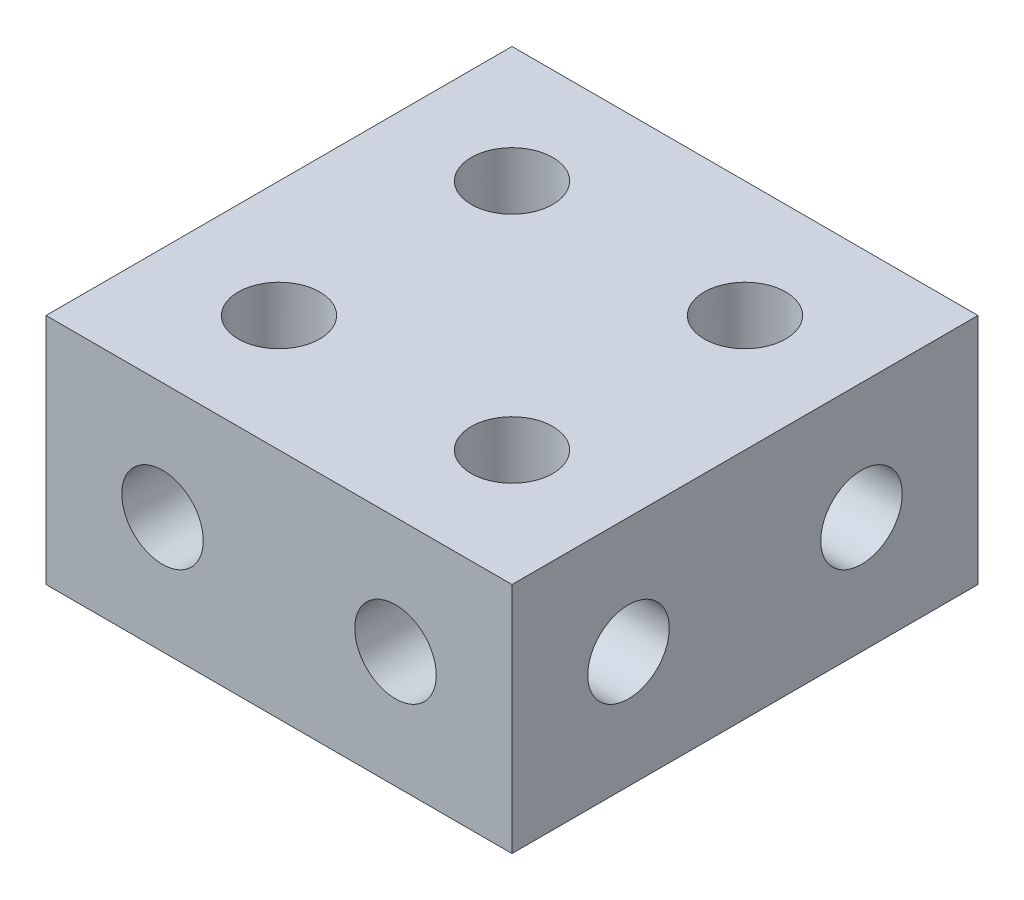
ISO-10303-21;
HEADER;
FILE_DESCRIPTION(('STEP AP214'),'2;1');
FILE_NAME('part.step','',(''),(''),'','','');
FILE_SCHEMA(('AUTOMOTIVE_DESIGN { 1 0 10303 214 1 1 1 1 }'));
ENDSEC;
DATA;
#1=APPLICATION_CONTEXT('core data for automotive mechanical design processes');
#2=APPLICATION_PROTOCOL_DEFINITION('international standard','automotive_design',2000,#1);
#3=PRODUCT_CONTEXT('',#1,'mechanical');
#4=PRODUCT('Part','Part','',(#3));
#5=PRODUCT_RELATED_PRODUCT_CATEGORY('part','',(#4));
#6=PRODUCT_DEFINITION_FORMATION('','',#4);
#7=PRODUCT_DEFINITION_CONTEXT('part definition',#1,'design');
#8=PRODUCT_DEFINITION('design','',#6,#7);
#9=PRODUCT_DEFINITION_SHAPE('','',#8);
#10=(LENGTH_UNIT() NAMED_UNIT(*) SI_UNIT(.MILLI.,.METRE.));
#11=(NAMED_UNIT(*) PLANE_ANGLE_UNIT() SI_UNIT($,.RADIAN.));
#12=(NAMED_UNIT(*) SI_UNIT($,.STERADIAN.) SOLID_ANGLE_UNIT());
#13=UNCERTAINTY_MEASURE_WITH_UNIT(LENGTH_MEASURE(1.E-05),#10,'distance_accuracy_value','');
#14=(GEOMETRIC_REPRESENTATION_CONTEXT(3) GLOBAL_UNCERTAINTY_ASSIGNED_CONTEXT((#13)) GLOBAL_UNIT_ASSIGNED_CONTEXT((#10,
#11,#12)) REPRESENTATION_CONTEXT('',''));
#15=CARTESIAN_POINT('',(0.,0.,0.));
#16=DIRECTION('',(0.,0.,1.));
#17=DIRECTION('',(1.,0.,0.));
#18=AXIS2_PLACEMENT_3D('',#15,#16,#17);
#19=CARTESIAN_POINT('',(15.0000000000001,0.,-5.));
#20=DIRECTION('',(0.,1.,0.));
#21=DIRECTION('',(0.,0.,1.));
#22=AXIS2_PLACEMENT_3D('',#19,#20,#21);
#23=CYLINDRICAL_SURFACE('',#22,1.75);
#24=CARTESIAN_POINT('',(15.0000000000001,10.,-5.));
#25=DIRECTION('',(0.,1.,0.));
#26=DIRECTION('',(0.,0.,1.));
#27=AXIS2_PLACEMENT_3D('',#24,#25,#26);
#28=CIRCLE('',#27,1.75);
#29=CARTESIAN_POINT('',(15.0000000000001,10.,-3.25));
#30=VERTEX_POINT('',#29);
#31=EDGE_CURVE('E254',#30,#30,#28,.T.);
#32=ORIENTED_EDGE('',*,*,#31,.T.);
#33=EDGE_LOOP('',(#32));
#34=FACE_BOUND('',#33,.T.);
#35=CARTESIAN_POINT('',(15.0000000000001,5.,-5.));
#36=DIRECTION('',(0.,0.707106781186547,-0.707106781186547));
#37=DIRECTION('',(0.,0.707106781186547,0.707106781186547));
#38=AXIS2_PLACEMENT_3D('',#35,#36,#37);
#39=ELLIPSE('',#38,2.47487373415291,1.75);
#40=CARTESIAN_POINT('',(16.2374368670765,6.23743686707647,-3.76256313292353));
#41=VERTEX_POINT('',#40);
#42=CARTESIAN_POINT('',(13.7625631329236,6.23743686707644,-3.76256313292355));
#43=VERTEX_POINT('',#42);
#44=EDGE_CURVE('E208',#41,#43,#39,.F.);
#45=ORIENTED_EDGE('',*,*,#44,.T.);
#46=CARTESIAN_POINT('',(15.0000000000001,5.,-5.));
#47=DIRECTION('',(0.707106781186547,0.707106781186547,0.));
#48=DIRECTION('',(-0.707106781186547,0.707106781186547,0.));
#49=AXIS2_PLACEMENT_3D('',#46,#47,#48);
#50=ELLIPSE('',#49,2.47487373415292,1.75);
#51=CARTESIAN_POINT('',(13.7625631329236,6.23743686707647,-6.23743686707647));
#52=VERTEX_POINT('',#51);
#53=EDGE_CURVE('E217',#43,#52,#50,.F.);
#54=ORIENTED_EDGE('',*,*,#53,.T.);
#55=CARTESIAN_POINT('',(15.0000000000001,5.,-5.));
#56=DIRECTION('',(0.,0.707106781186547,0.707106781186547));
#57=DIRECTION('',(0.,0.707106781186547,-0.707106781186547));
#58=AXIS2_PLACEMENT_3D('',#55,#56,#57);
#59=ELLIPSE('',#58,2.47487373415291,1.75);
#60=CARTESIAN_POINT('',(16.2374368670765,6.23743686707645,-6.23743686707644));
#61=VERTEX_POINT('',#60);
#62=EDGE_CURVE('E231',#52,#61,#59,.F.);
#63=ORIENTED_EDGE('',*,*,#62,.T.);
#64=CARTESIAN_POINT('',(15.0000000000001,5.,-5.));
#65=DIRECTION('',(-0.707106781186547,0.707106781186547,0.));
#66=DIRECTION('',(0.707106781186547,0.707106781186547,0.));
#67=AXIS2_PLACEMENT_3D('',#64,#65,#66);
#68=ELLIPSE('',#67,2.47487373415292,1.75);
#69=EDGE_CURVE('E219',#61,#41,#68,.F.);
#70=ORIENTED_EDGE('',*,*,#69,.T.);
#71=EDGE_LOOP('',(#45,#54,#63,#70));
#72=FACE_BOUND('',#71,.T.);
#73=ADVANCED_FACE('F33',(#34,#72),#23,.F.);
#74=CARTESIAN_POINT('',(15.,0.,-15.));
#75=DIRECTION('',(0.,1.,0.));
#76=DIRECTION('',(0.,0.,1.));
#77=AXIS2_PLACEMENT_3D('',#74,#75,#76);
#78=CYLINDRICAL_SURFACE('',#77,1.75);
#79=CARTESIAN_POINT('',(15.,10.,-15.));
#80=DIRECTION('',(0.,1.,0.));
#81=DIRECTION('',(0.,0.,1.));
#82=AXIS2_PLACEMENT_3D('',#79,#80,#81);
#83=CIRCLE('',#82,1.75);
#84=CARTESIAN_POINT('',(15.,10.,-13.25));
#85=VERTEX_POINT('',#84);
#86=EDGE_CURVE('E259',#85,#85,#83,.T.);
#87=ORIENTED_EDGE('',*,*,#86,.T.);
#88=EDGE_LOOP('',(#87));
#89=FACE_BOUND('',#88,.T.);
#90=CARTESIAN_POINT('',(15.,5.,-15.));
#91=DIRECTION('',(0.,0.707106781186547,-0.707106781186547));
#92=DIRECTION('',(0.,0.707106781186547,0.707106781186547));
#93=AXIS2_PLACEMENT_3D('',#90,#91,#92);
#94=ELLIPSE('',#93,2.47487373415292,1.75);
#95=CARTESIAN_POINT('',(16.2374368670765,6.23743686707646,-13.7625631329235));
#96=VERTEX_POINT('',#95);
#97=CARTESIAN_POINT('',(13.7625631329235,6.23743686707646,-13.7625631329235));
#98=VERTEX_POINT('',#97);
#99=EDGE_CURVE('E187',#96,#98,#94,.F.);
#100=ORIENTED_EDGE('',*,*,#99,.T.);
#101=CARTESIAN_POINT('',(15.,5.,-15.));
#102=DIRECTION('',(0.707106781186547,0.707106781186547,0.));
#103=DIRECTION('',(-0.707106781186547,0.707106781186547,0.));
#104=AXIS2_PLACEMENT_3D('',#101,#102,#103);
#105=ELLIPSE('',#104,2.47487373415292,1.75);
#106=CARTESIAN_POINT('',(13.7625631329235,6.23743686707646,-16.2374368670765));
#107=VERTEX_POINT('',#106);
#108=EDGE_CURVE('E171',#98,#107,#105,.F.);
#109=ORIENTED_EDGE('',*,*,#108,.T.);
#110=CARTESIAN_POINT('',(15.,5.,-15.));
#111=DIRECTION('',(0.,0.707106781186547,0.707106781186547));
#112=DIRECTION('',(0.,0.707106781186547,-0.707106781186547));
#113=AXIS2_PLACEMENT_3D('',#110,#111,#112);
#114=ELLIPSE('',#113,2.47487373415292,1.75);
#115=CARTESIAN_POINT('',(16.2374368670765,6.23743686707646,-16.2374368670765));
#116=VERTEX_POINT('',#115);
#117=EDGE_CURVE('E185',#107,#116,#114,.F.);
#118=ORIENTED_EDGE('',*,*,#117,.T.);
#119=CARTESIAN_POINT('',(15.,5.,-15.));
#120=DIRECTION('',(-0.707106781186547,0.707106781186547,0.));
#121=DIRECTION('',(0.707106781186547,0.707106781186547,0.));
#122=AXIS2_PLACEMENT_3D('',#119,#120,#121);
#123=ELLIPSE('',#122,2.47487373415292,1.75);
#124=EDGE_CURVE('E328',#116,#96,#123,.F.);
#125=ORIENTED_EDGE('',*,*,#124,.T.);
#126=EDGE_LOOP('',(#100,#109,#118,#125));
#127=FACE_BOUND('',#126,.T.);
#128=ADVANCED_FACE('F183',(#89,#127),#78,.F.);
#129=CARTESIAN_POINT('',(5.,0.,-15.));
#130=DIRECTION('',(0.,1.,0.));
#131=DIRECTION('',(0.,0.,1.));
#132=AXIS2_PLACEMENT_3D('',#129,#130,#131);
#133=CYLINDRICAL_SURFACE('',#132,1.75);
#134=CARTESIAN_POINT('',(5.,10.,-15.));
#135=DIRECTION('',(0.,1.,0.));
#136=DIRECTION('',(0.,0.,1.));
#137=AXIS2_PLACEMENT_3D('',#134,#135,#136);
#138=CIRCLE('',#137,1.75);
#139=CARTESIAN_POINT('',(5.,10.,-13.25));
#140=VERTEX_POINT('',#139);
#141=EDGE_CURVE('E258',#140,#140,#138,.T.);
#142=ORIENTED_EDGE('',*,*,#141,.T.);
#143=EDGE_LOOP('',(#142));
#144=FACE_BOUND('',#143,.T.);
#145=CARTESIAN_POINT('',(5.,5.,-15.));
#146=DIRECTION('',(0.,0.707106781186547,-0.707106781186547));
#147=DIRECTION('',(0.,0.707106781186547,0.707106781186547));
#148=AXIS2_PLACEMENT_3D('',#145,#146,#147);
#149=ELLIPSE('',#148,2.47487373415292,1.75);
#150=CARTESIAN_POINT('',(6.23743686707646,6.23743686707646,-13.7625631329235));
#151=VERTEX_POINT('',#150);
#152=CARTESIAN_POINT('',(3.76256313292354,6.23743686707646,-13.7625631329235));
#153=VERTEX_POINT('',#152);
#154=EDGE_CURVE('E239',#151,#153,#149,.F.);
#155=ORIENTED_EDGE('',*,*,#154,.T.);
#156=CARTESIAN_POINT('',(5.,5.,-15.));
#157=DIRECTION('',(0.707106781186547,0.707106781186547,0.));
#158=DIRECTION('',(-0.707106781186547,0.707106781186547,0.));
#159=AXIS2_PLACEMENT_3D('',#156,#157,#158);
#160=ELLIPSE('',#159,2.47487373415292,1.75);
#161=CARTESIAN_POINT('',(3.76256313292354,6.23743686707646,-16.2374368670765));
#162=VERTEX_POINT('',#161);
#163=EDGE_CURVE('E338',#153,#162,#160,.F.);
#164=ORIENTED_EDGE('',*,*,#163,.T.);
#165=CARTESIAN_POINT('',(5.,5.,-15.));
#166=DIRECTION('',(0.,0.707106781186547,0.707106781186547));
#167=DIRECTION('',(0.,0.707106781186547,-0.707106781186547));
#168=AXIS2_PLACEMENT_3D('',#165,#166,#167);
#169=ELLIPSE('',#168,2.47487373415292,1.75);
#170=CARTESIAN_POINT('',(6.23743686707646,6.23743686707646,-16.2374368670765));
#171=VERTEX_POINT('',#170);
#172=EDGE_CURVE('E248',#162,#171,#169,.F.);
#173=ORIENTED_EDGE('',*,*,#172,.T.);
#174=CARTESIAN_POINT('',(5.,5.,-15.));
#175=DIRECTION('',(-0.707106781186547,0.707106781186547,0.));
#176=DIRECTION('',(0.707106781186547,0.707106781186547,0.));
#177=AXIS2_PLACEMENT_3D('',#174,#175,#176);
#178=ELLIPSE('',#177,2.47487373415292,1.75);
#179=EDGE_CURVE('E48',#171,#151,#178,.F.);
#180=ORIENTED_EDGE('',*,*,#179,.T.);
#181=EDGE_LOOP('',(#155,#164,#173,#180));
#182=FACE_BOUND('',#181,.T.);
#183=ADVANCED_FACE('F444',(#144,#182),#133,.F.);
#184=CARTESIAN_POINT('',(5.00000000000011,0.,-5.));
#185=DIRECTION('',(0.,1.,0.));
#186=DIRECTION('',(0.,0.,1.));
#187=AXIS2_PLACEMENT_3D('',#184,#185,#186);
#188=CYLINDRICAL_SURFACE('',#187,1.75);
#189=CARTESIAN_POINT('',(5.00000000000011,10.,-5.));
#190=DIRECTION('',(0.,1.,0.));
#191=DIRECTION('',(0.,0.,1.));
#192=AXIS2_PLACEMENT_3D('',#189,#190,#191);
#193=CIRCLE('',#192,1.75);
#194=CARTESIAN_POINT('',(5.00000000000011,10.,-3.25));
#195=VERTEX_POINT('',#194);
#196=EDGE_CURVE('E265',#195,#195,#193,.T.);
#197=ORIENTED_EDGE('',*,*,#196,.T.);
#198=EDGE_LOOP('',(#197));
#199=FACE_BOUND('',#198,.T.);
#200=CARTESIAN_POINT('',(5.00000000000006,5.,-5.));
#201=DIRECTION('',(0.,0.707106781186547,-0.707106781186547));
#202=DIRECTION('',(0.,0.707106781186547,0.707106781186547));
#203=AXIS2_PLACEMENT_3D('',#200,#201,#202);
#204=ELLIPSE('',#203,2.47487373415292,1.75);
#205=CARTESIAN_POINT('',(6.23743686707655,6.23743686707644,-3.76256313292355));
#206=VERTEX_POINT('',#205);
#207=CARTESIAN_POINT('',(3.76256313292364,6.23743686707647,-3.76256313292353));
#208=VERTEX_POINT('',#207);
#209=EDGE_CURVE('E308',#206,#208,#204,.F.);
#210=ORIENTED_EDGE('',*,*,#209,.T.);
#211=CARTESIAN_POINT('',(5.00000000000011,5.,-5.));
#212=DIRECTION('',(0.707106781186547,0.707106781186547,0.));
#213=DIRECTION('',(-0.707106781186547,0.707106781186547,0.));
#214=AXIS2_PLACEMENT_3D('',#211,#212,#213);
#215=ELLIPSE('',#214,2.47487373415292,1.75);
#216=CARTESIAN_POINT('',(3.76256313292356,6.23743686707645,-6.23743686707644));
#217=VERTEX_POINT('',#216);
#218=EDGE_CURVE('E378',#208,#217,#215,.F.);
#219=ORIENTED_EDGE('',*,*,#218,.T.);
#220=CARTESIAN_POINT('',(5.00000000000006,5.,-5.));
#221=DIRECTION('',(0.,0.707106781186547,0.707106781186547));
#222=DIRECTION('',(0.,0.707106781186547,-0.707106781186547));
#223=AXIS2_PLACEMENT_3D('',#220,#221,#222);
#224=ELLIPSE('',#223,2.47487373415292,1.75);
#225=CARTESIAN_POINT('',(6.23743686707647,6.23743686707647,-6.23743686707647));
#226=VERTEX_POINT('',#225);
#227=EDGE_CURVE('E317',#217,#226,#224,.F.);
#228=ORIENTED_EDGE('',*,*,#227,.T.);
#229=CARTESIAN_POINT('',(5.00000000000011,5.,-5.));
#230=DIRECTION('',(-0.707106781186547,0.707106781186547,0.));
#231=DIRECTION('',(0.707106781186547,0.707106781186547,0.));
#232=AXIS2_PLACEMENT_3D('',#229,#230,#231);
#233=ELLIPSE('',#232,2.47487373415292,1.75);
#234=EDGE_CURVE('E390',#226,#206,#233,.F.);
#235=ORIENTED_EDGE('',*,*,#234,.T.);
#236=EDGE_LOOP('',(#210,#219,#228,#235));
#237=FACE_BOUND('',#236,.T.);
#238=ADVANCED_FACE('F456',(#199,#237),#188,.F.);
#239=CARTESIAN_POINT('',(20.,0.,0.));
#240=DIRECTION('',(0.,0.,-1.));
#241=DIRECTION('',(-1.,0.,0.));
#242=AXIS2_PLACEMENT_3D('',#239,#240,#241);
#243=PLANE('',#242);
#244=CARTESIAN_POINT('',(15.,5.,0.));
#245=DIRECTION('',(0.,0.,1.));
#246=DIRECTION('',(1.,0.,0.));
#247=AXIS2_PLACEMENT_3D('',#244,#245,#246);
#248=CIRCLE('',#247,1.75);
#249=CARTESIAN_POINT('',(16.75,5.,0.));
#250=VERTEX_POINT('',#249);
#251=EDGE_CURVE('E221',#250,#250,#248,.T.);
#252=ORIENTED_EDGE('',*,*,#251,.F.);
#253=EDGE_LOOP('',(#252));
#254=FACE_BOUND('',#253,.T.);
#255=CARTESIAN_POINT('',(5.,5.,0.));
#256=DIRECTION('',(0.,0.,1.));
#257=DIRECTION('',(1.,0.,0.));
#258=AXIS2_PLACEMENT_3D('',#255,#256,#257);
#259=CIRCLE('',#258,1.75);
#260=CARTESIAN_POINT('',(6.75,5.,0.));
#261=VERTEX_POINT('',#260);
#262=EDGE_CURVE('E236',#261,#261,#259,.T.);
#263=ORIENTED_EDGE('',*,*,#262,.F.);
#264=EDGE_LOOP('',(#263));
#265=FACE_BOUND('',#264,.T.);
#266=DIRECTION('',(0.,-1.,0.));
#267=VECTOR('',#266,1.);
#268=CARTESIAN_POINT('',(0.,0.,0.));
#269=LINE('',#268,#267);
#270=CARTESIAN_POINT('',(0.,10.,0.));
#271=VERTEX_POINT('',#270);
#272=CARTESIAN_POINT('',(0.,0.,0.));
#273=VERTEX_POINT('',#272);
#274=EDGE_CURVE('E276',#271,#273,#269,.T.);
#275=ORIENTED_EDGE('',*,*,#274,.T.);
#276=DIRECTION('',(-1.,0.,0.));
#277=VECTOR('',#276,1.);
#278=CARTESIAN_POINT('',(20.,0.,0.));
#279=LINE('',#278,#277);
#280=CARTESIAN_POINT('',(20.,0.,0.));
#281=VERTEX_POINT('',#280);
#282=EDGE_CURVE('E305',#281,#273,#279,.T.);
#283=ORIENTED_EDGE('',*,*,#282,.F.);
#284=DIRECTION('',(0.,-1.,0.));
#285=VECTOR('',#284,1.);
#286=CARTESIAN_POINT('',(20.,0.,0.));
#287=LINE('',#286,#285);
#288=CARTESIAN_POINT('',(20.,10.,0.));
#289=VERTEX_POINT('',#288);
#290=EDGE_CURVE('E279',#289,#281,#287,.T.);
#291=ORIENTED_EDGE('',*,*,#290,.F.);
#292=DIRECTION('',(-1.,0.,0.));
#293=VECTOR('',#292,1.);
#294=CARTESIAN_POINT('',(20.,10.,0.));
#295=LINE('',#294,#293);
#296=EDGE_CURVE('E289',#289,#271,#295,.T.);
#297=ORIENTED_EDGE('',*,*,#296,.T.);
#298=EDGE_LOOP('',(#275,#283,#291,#297));
#299=FACE_BOUND('',#298,.T.);
#300=ADVANCED_FACE('F35',(#254,#265,#299),#243,.F.);
#301=CARTESIAN_POINT('',(20.,0.,0.));
#302=DIRECTION('',(0.,1.,0.));
#303=DIRECTION('',(0.,0.,1.));
#304=AXIS2_PLACEMENT_3D('',#301,#302,#303);
#305=PLANE('',#304);
#306=CARTESIAN_POINT('',(15.,0.,-15.));
#307=DIRECTION('',(0.,1.,0.));
#308=DIRECTION('',(0.,0.,1.));
#309=AXIS2_PLACEMENT_3D('',#306,#307,#308);
#310=CIRCLE('',#309,1.75);
#311=CARTESIAN_POINT('',(15.,0.,-13.25));
#312=VERTEX_POINT('',#311);
#313=EDGE_CURVE('E255',#312,#312,#310,.T.);
#314=ORIENTED_EDGE('',*,*,#313,.T.);
#315=EDGE_LOOP('',(#314));
#316=FACE_BOUND('',#315,.T.);
#317=CARTESIAN_POINT('',(5.00000000000011,0.,-5.));
#318=DIRECTION('',(0.,1.,0.));
#319=DIRECTION('',(0.,0.,1.));
#320=AXIS2_PLACEMENT_3D('',#317,#318,#319);
#321=CIRCLE('',#320,1.75);
#322=CARTESIAN_POINT('',(5.00000000000011,0.,-3.25));
#323=VERTEX_POINT('',#322);
#324=EDGE_CURVE('E262',#323,#323,#321,.T.);
#325=ORIENTED_EDGE('',*,*,#324,.T.);
#326=EDGE_LOOP('',(#325));
#327=FACE_BOUND('',#326,.T.);
#328=CARTESIAN_POINT('',(15.0000000000001,0.,-5.));
#329=DIRECTION('',(0.,1.,0.));
#330=DIRECTION('',(0.,0.,1.));
#331=AXIS2_PLACEMENT_3D('',#328,#329,#330);
#332=CIRCLE('',#331,1.75);
#333=CARTESIAN_POINT('',(15.0000000000001,0.,-3.25));
#334=VERTEX_POINT('',#333);
#335=EDGE_CURVE('E268',#334,#334,#332,.T.);
#336=ORIENTED_EDGE('',*,*,#335,.T.);
#337=EDGE_LOOP('',(#336));
#338=FACE_BOUND('',#337,.T.);
#339=CARTESIAN_POINT('',(5.,0.,-15.));
#340=DIRECTION('',(0.,1.,0.));
#341=DIRECTION('',(0.,0.,1.));
#342=AXIS2_PLACEMENT_3D('',#339,#340,#341);
#343=CIRCLE('',#342,1.75);
#344=CARTESIAN_POINT('',(5.,0.,-13.25));
#345=VERTEX_POINT('',#344);
#346=EDGE_CURVE('E273',#345,#345,#343,.T.);
#347=ORIENTED_EDGE('',*,*,#346,.T.);
#348=EDGE_LOOP('',(#347));
#349=FACE_BOUND('',#348,.T.);
#350=DIRECTION('',(0.,0.,-1.));
#351=VECTOR('',#350,1.);
#352=CARTESIAN_POINT('',(0.,0.,0.));
#353=LINE('',#352,#351);
#354=CARTESIAN_POINT('',(0.,0.,-20.));
#355=VERTEX_POINT('',#354);
#356=EDGE_CURVE('E292',#273,#355,#353,.T.);
#357=ORIENTED_EDGE('',*,*,#356,.T.);
#358=DIRECTION('',(-1.,0.,0.));
#359=VECTOR('',#358,1.);
#360=CARTESIAN_POINT('',(20.,0.,-20.));
#361=LINE('',#360,#359);
#362=CARTESIAN_POINT('',(20.,0.,-20.));
#363=VERTEX_POINT('',#362);
#364=EDGE_CURVE('E302',#363,#355,#361,.T.);
#365=ORIENTED_EDGE('',*,*,#364,.F.);
#366=DIRECTION('',(0.,0.,-1.));
#367=VECTOR('',#366,1.);
#368=CARTESIAN_POINT('',(20.,0.,0.));
#369=LINE('',#368,#367);
#370=EDGE_CURVE('E282',#281,#363,#369,.T.);
#371=ORIENTED_EDGE('',*,*,#370,.F.);
#372=ORIENTED_EDGE('',*,*,#282,.T.);
#373=EDGE_LOOP('',(#357,#365,#371,#372));
#374=FACE_BOUND('',#373,.T.);
#375=ADVANCED_FACE('F424',(#316,#327,#338,#349,#374),#305,.F.);
#376=CARTESIAN_POINT('',(20.,0.,-20.));
#377=DIRECTION('',(0.,0.,1.));
#378=DIRECTION('',(1.,0.,0.));
#379=AXIS2_PLACEMENT_3D('',#376,#377,#378);
#380=PLANE('',#379);
#381=CARTESIAN_POINT('',(15.,5.,-20.));
#382=DIRECTION('',(0.,0.,1.));
#383=DIRECTION('',(1.,0.,0.));
#384=AXIS2_PLACEMENT_3D('',#381,#382,#383);
#385=CIRCLE('',#384,1.75);
#386=CARTESIAN_POINT('',(16.75,5.,-20.));
#387=VERTEX_POINT('',#386);
#388=EDGE_CURVE('E233',#387,#387,#385,.T.);
#389=ORIENTED_EDGE('',*,*,#388,.T.);
#390=EDGE_LOOP('',(#389));
#391=FACE_BOUND('',#390,.T.);
#392=CARTESIAN_POINT('',(5.,5.,-20.));
#393=DIRECTION('',(0.,0.,1.));
#394=DIRECTION('',(1.,0.,0.));
#395=AXIS2_PLACEMENT_3D('',#392,#393,#394);
#396=CIRCLE('',#395,1.75);
#397=CARTESIAN_POINT('',(6.75,5.,-20.));
#398=VERTEX_POINT('',#397);
#399=EDGE_CURVE('E251',#398,#398,#396,.T.);
#400=ORIENTED_EDGE('',*,*,#399,.T.);
#401=EDGE_LOOP('',(#400));
#402=FACE_BOUND('',#401,.T.);
#403=DIRECTION('',(0.,1.,0.));
#404=VECTOR('',#403,1.);
#405=CARTESIAN_POINT('',(0.,0.,-20.));
#406=LINE('',#405,#404);
#407=CARTESIAN_POINT('',(0.,10.,-20.));
#408=VERTEX_POINT('',#407);
#409=EDGE_CURVE('E294',#355,#408,#406,.T.);
#410=ORIENTED_EDGE('',*,*,#409,.T.);
#411=DIRECTION('',(-1.,0.,0.));
#412=VECTOR('',#411,1.);
#413=CARTESIAN_POINT('',(20.,10.,-20.));
#414=LINE('',#413,#412);
#415=CARTESIAN_POINT('',(20.,10.,-20.));
#416=VERTEX_POINT('',#415);
#417=EDGE_CURVE('E299',#416,#408,#414,.T.);
#418=ORIENTED_EDGE('',*,*,#417,.F.);
#419=DIRECTION('',(0.,1.,0.));
#420=VECTOR('',#419,1.);
#421=CARTESIAN_POINT('',(20.,0.,-20.));
#422=LINE('',#421,#420);
#423=EDGE_CURVE('E285',#363,#416,#422,.T.);
#424=ORIENTED_EDGE('',*,*,#423,.F.);
#425=ORIENTED_EDGE('',*,*,#364,.T.);
#426=EDGE_LOOP('',(#410,#418,#424,#425));
#427=FACE_BOUND('',#426,.T.);
#428=ADVANCED_FACE('F421',(#391,#402,#427),#380,.F.);
#429=CARTESIAN_POINT('',(20.,10.,0.));
#430=DIRECTION('',(0.,-1.,0.));
#431=DIRECTION('',(0.,0.,-1.));
#432=AXIS2_PLACEMENT_3D('',#429,#430,#431);
#433=PLANE('',#432);
#434=ORIENTED_EDGE('',*,*,#86,.F.);
#435=EDGE_LOOP('',(#434));
#436=FACE_BOUND('',#435,.T.);
#437=ORIENTED_EDGE('',*,*,#196,.F.);
#438=EDGE_LOOP('',(#437));
#439=FACE_BOUND('',#438,.T.);
#440=ORIENTED_EDGE('',*,*,#31,.F.);
#441=EDGE_LOOP('',(#440));
#442=FACE_BOUND('',#441,.T.);
#443=ORIENTED_EDGE('',*,*,#141,.F.);
#444=EDGE_LOOP('',(#443));
#445=FACE_BOUND('',#444,.T.);
#446=DIRECTION('',(0.,0.,1.));
#447=VECTOR('',#446,1.);
#448=CARTESIAN_POINT('',(0.,10.,0.));
#449=LINE('',#448,#447);
#450=EDGE_CURVE('E283',#408,#271,#449,.T.);
#451=ORIENTED_EDGE('',*,*,#450,.T.);
#452=ORIENTED_EDGE('',*,*,#296,.F.);
#453=DIRECTION('',(0.,0.,1.));
#454=VECTOR('',#453,1.);
#455=CARTESIAN_POINT('',(20.,10.,0.));
#456=LINE('',#455,#454);
#457=EDGE_CURVE('E287',#416,#289,#456,.T.);
#458=ORIENTED_EDGE('',*,*,#457,.F.);
#459=ORIENTED_EDGE('',*,*,#417,.T.);
#460=EDGE_LOOP('',(#451,#452,#458,#459));
#461=FACE_BOUND('',#460,.T.);
#462=ADVANCED_FACE('F417',(#436,#439,#442,#445,#461),#433,.F.);
#463=CARTESIAN_POINT('',(20.,0.,0.));
#464=DIRECTION('',(-1.,0.,0.));
#465=DIRECTION('',(0.,0.,1.));
#466=AXIS2_PLACEMENT_3D('',#463,#464,#465);
#467=PLANE('',#466);
#468=CARTESIAN_POINT('',(20.,5.,-15.));
#469=DIRECTION('',(1.,0.,0.));
#470=DIRECTION('',(0.,0.,-1.));
#471=AXIS2_PLACEMENT_3D('',#468,#469,#470);
#472=CIRCLE('',#471,1.75);
#473=CARTESIAN_POINT('',(20.,5.,-16.75));
#474=VERTEX_POINT('',#473);
#475=EDGE_CURVE('E693',#474,#474,#472,.T.);
#476=ORIENTED_EDGE('',*,*,#475,.F.);
#477=EDGE_LOOP('',(#476));
#478=FACE_BOUND('',#477,.T.);
#479=CARTESIAN_POINT('',(20.,5.,-5.));
#480=DIRECTION('',(1.,0.,0.));
#481=DIRECTION('',(0.,0.,-1.));
#482=AXIS2_PLACEMENT_3D('',#479,#480,#481);
#483=CIRCLE('',#482,1.75);
#484=CARTESIAN_POINT('',(20.,5.,-6.75));
#485=VERTEX_POINT('',#484);
#486=EDGE_CURVE('E356',#485,#485,#483,.T.);
#487=ORIENTED_EDGE('',*,*,#486,.F.);
#488=EDGE_LOOP('',(#487));
#489=FACE_BOUND('',#488,.T.);
#490=ORIENTED_EDGE('',*,*,#290,.T.);
#491=ORIENTED_EDGE('',*,*,#370,.T.);
#492=ORIENTED_EDGE('',*,*,#423,.T.);
#493=ORIENTED_EDGE('',*,*,#457,.T.);
#494=EDGE_LOOP('',(#490,#491,#492,#493));
#495=FACE_BOUND('',#494,.T.);
#496=ADVANCED_FACE('F405',(#478,#489,#495),#467,.F.);
#497=CARTESIAN_POINT('',(0.,0.,0.));
#498=DIRECTION('',(-1.,0.,0.));
#499=DIRECTION('',(0.,0.,1.));
#500=AXIS2_PLACEMENT_3D('',#497,#498,#499);
#501=PLANE('',#500);
#502=CARTESIAN_POINT('',(0.,5.,-15.));
#503=DIRECTION('',(-1.,0.,0.));
#504=DIRECTION('',(0.,0.,1.));
#505=AXIS2_PLACEMENT_3D('',#502,#503,#504);
#506=CIRCLE('',#505,1.75);
#507=CARTESIAN_POINT('',(0.,5.,-13.25));
#508=VERTEX_POINT('',#507);
#509=EDGE_CURVE('E353',#508,#508,#506,.T.);
#510=ORIENTED_EDGE('',*,*,#509,.F.);
#511=EDGE_LOOP('',(#510));
#512=FACE_BOUND('',#511,.T.);
#513=CARTESIAN_POINT('',(0.,5.,-5.));
#514=DIRECTION('',(-1.,0.,0.));
#515=DIRECTION('',(0.,0.,1.));
#516=AXIS2_PLACEMENT_3D('',#513,#514,#515);
#517=CIRCLE('',#516,1.75);
#518=CARTESIAN_POINT('',(0.,5.,-3.25));
#519=VERTEX_POINT('',#518);
#520=EDGE_CURVE('E226',#519,#519,#517,.T.);
#521=ORIENTED_EDGE('',*,*,#520,.F.);
#522=EDGE_LOOP('',(#521));
#523=FACE_BOUND('',#522,.T.);
#524=ORIENTED_EDGE('',*,*,#274,.F.);
#525=ORIENTED_EDGE('',*,*,#450,.F.);
#526=ORIENTED_EDGE('',*,*,#409,.F.);
#527=ORIENTED_EDGE('',*,*,#356,.F.);
#528=EDGE_LOOP('',(#524,#525,#526,#527));
#529=FACE_BOUND('',#528,.T.);
#530=ADVANCED_FACE('F401',(#512,#523,#529),#501,.T.);
#531=CARTESIAN_POINT('',(5.,5.,-15.));
#532=DIRECTION('',(0.,0.707106781186547,0.707106781186547));
#533=DIRECTION('',(0.,0.707106781186547,-0.707106781186547));
#534=AXIS2_PLACEMENT_3D('',#531,#532,#533);
#535=ELLIPSE('',#534,2.47487373415292,1.75);
#536=CARTESIAN_POINT('',(3.76256313292354,3.76256313292354,-13.7625631329235));
#537=VERTEX_POINT('',#536);
#538=CARTESIAN_POINT('',(6.23743686707646,3.76256313292354,-13.7625631329235));
#539=VERTEX_POINT('',#538);
#540=EDGE_CURVE('E245',#537,#539,#535,.T.);
#541=ORIENTED_EDGE('',*,*,#540,.T.);
#542=CARTESIAN_POINT('',(5.,5.,-15.));
#543=DIRECTION('',(0.707106781186547,0.707106781186547,0.));
#544=DIRECTION('',(-0.707106781186547,0.707106781186547,0.));
#545=AXIS2_PLACEMENT_3D('',#542,#543,#544);
#546=ELLIPSE('',#545,2.47487373415292,1.75);
#547=CARTESIAN_POINT('',(6.23743686707646,3.76256313292354,-16.2374368670765));
#548=VERTEX_POINT('',#547);
#549=EDGE_CURVE('E346',#539,#548,#546,.T.);
#550=ORIENTED_EDGE('',*,*,#549,.T.);
#551=CARTESIAN_POINT('',(5.,5.,-15.));
#552=DIRECTION('',(0.,0.707106781186547,-0.707106781186547));
#553=DIRECTION('',(0.,0.707106781186547,0.707106781186547));
#554=AXIS2_PLACEMENT_3D('',#551,#552,#553);
#555=ELLIPSE('',#554,2.47487373415292,1.75);
#556=CARTESIAN_POINT('',(3.76256313292354,3.76256313292354,-16.2374368670765));
#557=VERTEX_POINT('',#556);
#558=EDGE_CURVE('E242',#548,#557,#555,.T.);
#559=ORIENTED_EDGE('',*,*,#558,.T.);
#560=CARTESIAN_POINT('',(5.,5.,-15.));
#561=DIRECTION('',(-0.707106781186547,0.707106781186547,0.));
#562=DIRECTION('',(0.707106781186547,0.707106781186547,0.));
#563=AXIS2_PLACEMENT_3D('',#560,#561,#562);
#564=ELLIPSE('',#563,2.47487373415292,1.75);
#565=EDGE_CURVE('E56',#557,#537,#564,.T.);
#566=ORIENTED_EDGE('',*,*,#565,.T.);
#567=EDGE_LOOP('',(#541,#550,#559,#566));
#568=FACE_BOUND('',#567,.T.);
#569=ORIENTED_EDGE('',*,*,#346,.F.);
#570=EDGE_LOOP('',(#569));
#571=FACE_BOUND('',#570,.T.);
#572=ADVANCED_FACE('F404',(#568,#571),#133,.F.);
#573=CARTESIAN_POINT('',(15.0000000000001,5.,-5.));
#574=DIRECTION('',(0.,0.707106781186547,0.707106781186547));
#575=DIRECTION('',(0.,0.707106781186547,-0.707106781186547));
#576=AXIS2_PLACEMENT_3D('',#573,#574,#575);
#577=ELLIPSE('',#576,2.47487373415291,1.75);
#578=CARTESIAN_POINT('',(13.7625631329236,3.76256313292356,-3.76256313292355));
#579=VERTEX_POINT('',#578);
#580=CARTESIAN_POINT('',(16.2374368670765,3.76256313292353,-3.76256313292353));
#581=VERTEX_POINT('',#580);
#582=EDGE_CURVE('E210',#579,#581,#577,.T.);
#583=ORIENTED_EDGE('',*,*,#582,.T.);
#584=CARTESIAN_POINT('',(15.0000000000001,5.,-5.));
#585=DIRECTION('',(0.707106781186547,0.707106781186547,0.));
#586=DIRECTION('',(-0.707106781186547,0.707106781186547,0.));
#587=AXIS2_PLACEMENT_3D('',#584,#585,#586);
#588=ELLIPSE('',#587,2.47487373415292,1.75);
#589=CARTESIAN_POINT('',(16.2374368670765,3.76256313292355,-6.23743686707644));
#590=VERTEX_POINT('',#589);
#591=EDGE_CURVE('E359',#581,#590,#588,.T.);
#592=ORIENTED_EDGE('',*,*,#591,.T.);
#593=CARTESIAN_POINT('',(15.0000000000001,5.,-5.));
#594=DIRECTION('',(0.,0.707106781186547,-0.707106781186547));
#595=DIRECTION('',(0.,0.707106781186547,0.707106781186547));
#596=AXIS2_PLACEMENT_3D('',#593,#594,#595);
#597=ELLIPSE('',#596,2.47487373415291,1.75);
#598=CARTESIAN_POINT('',(13.7625631329236,3.76256313292353,-6.23743686707647));
#599=VERTEX_POINT('',#598);
#600=EDGE_CURVE('E220',#590,#599,#597,.T.);
#601=ORIENTED_EDGE('',*,*,#600,.T.);
#602=CARTESIAN_POINT('',(15.0000000000001,5.,-5.));
#603=DIRECTION('',(-0.707106781186547,0.707106781186547,0.));
#604=DIRECTION('',(0.707106781186547,0.707106781186547,0.));
#605=AXIS2_PLACEMENT_3D('',#602,#603,#604);
#606=ELLIPSE('',#605,2.47487373415292,1.75);
#607=EDGE_CURVE('E366',#599,#579,#606,.T.);
#608=ORIENTED_EDGE('',*,*,#607,.T.);
#609=EDGE_LOOP('',(#583,#592,#601,#608));
#610=FACE_BOUND('',#609,.T.);
#611=ORIENTED_EDGE('',*,*,#335,.F.);
#612=EDGE_LOOP('',(#611));
#613=FACE_BOUND('',#612,.T.);
#614=ADVANCED_FACE('F440',(#610,#613),#23,.F.);
#615=CARTESIAN_POINT('',(5.00000000000006,5.,-5.));
#616=DIRECTION('',(0.,0.707106781186547,0.707106781186547));
#617=DIRECTION('',(0.,0.707106781186547,-0.707106781186547));
#618=AXIS2_PLACEMENT_3D('',#615,#616,#617);
#619=ELLIPSE('',#618,2.47487373415292,1.75);
#620=CARTESIAN_POINT('',(3.76256313292364,3.76256313292353,-3.76256313292353));
#621=VERTEX_POINT('',#620);
#622=CARTESIAN_POINT('',(6.23743686707655,3.76256313292356,-3.76256313292355));
#623=VERTEX_POINT('',#622);
#624=EDGE_CURVE('E314',#621,#623,#619,.T.);
#625=ORIENTED_EDGE('',*,*,#624,.T.);
#626=CARTESIAN_POINT('',(5.00000000000011,5.,-5.));
#627=DIRECTION('',(0.707106781186547,0.707106781186547,0.));
#628=DIRECTION('',(-0.707106781186547,0.707106781186547,0.));
#629=AXIS2_PLACEMENT_3D('',#626,#627,#628);
#630=ELLIPSE('',#629,2.47487373415292,1.75);
#631=CARTESIAN_POINT('',(6.23743686707647,3.76256313292353,-6.23743686707647));
#632=VERTEX_POINT('',#631);
#633=EDGE_CURVE('E387',#623,#632,#630,.T.);
#634=ORIENTED_EDGE('',*,*,#633,.T.);
#635=CARTESIAN_POINT('',(5.00000000000006,5.,-5.));
#636=DIRECTION('',(0.,0.707106781186547,-0.707106781186547));
#637=DIRECTION('',(0.,0.707106781186547,0.707106781186547));
#638=AXIS2_PLACEMENT_3D('',#635,#636,#637);
#639=ELLIPSE('',#638,2.47487373415292,1.75);
#640=CARTESIAN_POINT('',(3.76256313292356,3.76256313292355,-6.23743686707644));
#641=VERTEX_POINT('',#640);
#642=EDGE_CURVE('E311',#632,#641,#639,.T.);
#643=ORIENTED_EDGE('',*,*,#642,.T.);
#644=CARTESIAN_POINT('',(5.00000000000011,5.,-5.));
#645=DIRECTION('',(-0.707106781186547,0.707106781186547,0.));
#646=DIRECTION('',(0.707106781186547,0.707106781186547,0.));
#647=AXIS2_PLACEMENT_3D('',#644,#645,#646);
#648=ELLIPSE('',#647,2.47487373415292,1.75);
#649=EDGE_CURVE('E375',#641,#621,#648,.T.);
#650=ORIENTED_EDGE('',*,*,#649,.T.);
#651=EDGE_LOOP('',(#625,#634,#643,#650));
#652=FACE_BOUND('',#651,.T.);
#653=ORIENTED_EDGE('',*,*,#324,.F.);
#654=EDGE_LOOP('',(#653));
#655=FACE_BOUND('',#654,.T.);
#656=ADVANCED_FACE('F449',(#652,#655),#188,.F.);
#657=CARTESIAN_POINT('',(15.,5.,-15.));
#658=DIRECTION('',(0.,0.707106781186547,0.707106781186547));
#659=DIRECTION('',(0.,0.707106781186547,-0.707106781186547));
#660=AXIS2_PLACEMENT_3D('',#657,#658,#659);
#661=ELLIPSE('',#660,2.47487373415292,1.75);
#662=CARTESIAN_POINT('',(13.7625631329235,3.76256313292354,-13.7625631329235));
#663=VERTEX_POINT('',#662);
#664=CARTESIAN_POINT('',(16.2374368670765,3.76256313292354,-13.7625631329235));
#665=VERTEX_POINT('',#664);
#666=EDGE_CURVE('E193',#663,#665,#661,.T.);
#667=ORIENTED_EDGE('',*,*,#666,.T.);
#668=CARTESIAN_POINT('',(15.,5.,-15.));
#669=DIRECTION('',(0.707106781186547,0.707106781186547,0.));
#670=DIRECTION('',(-0.707106781186547,0.707106781186547,0.));
#671=AXIS2_PLACEMENT_3D('',#668,#669,#670);
#672=ELLIPSE('',#671,2.47487373415292,1.75);
#673=CARTESIAN_POINT('',(16.2374368670765,3.76256313292354,-16.2374368670765));
#674=VERTEX_POINT('',#673);
#675=EDGE_CURVE('E325',#665,#674,#672,.T.);
#676=ORIENTED_EDGE('',*,*,#675,.T.);
#677=CARTESIAN_POINT('',(15.,5.,-15.));
#678=DIRECTION('',(0.,0.707106781186547,-0.707106781186547));
#679=DIRECTION('',(0.,0.707106781186547,0.707106781186547));
#680=AXIS2_PLACEMENT_3D('',#677,#678,#679);
#681=ELLIPSE('',#680,2.47487373415292,1.75);
#682=CARTESIAN_POINT('',(13.7625631329235,3.76256313292354,-16.2374368670765));
#683=VERTEX_POINT('',#682);
#684=EDGE_CURVE('E198',#674,#683,#681,.T.);
#685=ORIENTED_EDGE('',*,*,#684,.T.);
#686=CARTESIAN_POINT('',(15.,5.,-15.));
#687=DIRECTION('',(-0.707106781186547,0.707106781186547,0.));
#688=DIRECTION('',(0.707106781186547,0.707106781186547,0.));
#689=AXIS2_PLACEMENT_3D('',#686,#687,#688);
#690=ELLIPSE('',#689,2.47487373415292,1.75);
#691=EDGE_CURVE('E174',#683,#663,#690,.T.);
#692=ORIENTED_EDGE('',*,*,#691,.T.);
#693=EDGE_LOOP('',(#667,#676,#685,#692));
#694=FACE_BOUND('',#693,.T.);
#695=ORIENTED_EDGE('',*,*,#313,.F.);
#696=EDGE_LOOP('',(#695));
#697=FACE_BOUND('',#696,.T.);
#698=ADVANCED_FACE('F322',(#694,#697),#78,.F.);
#699=CARTESIAN_POINT('',(5.,5.,-40.));
#700=DIRECTION('',(0.,0.,1.));
#701=DIRECTION('',(1.,0.,0.));
#702=AXIS2_PLACEMENT_3D('',#699,#700,#701);
#703=CYLINDRICAL_SURFACE('',#702,1.75);
#704=ORIENTED_EDGE('',*,*,#262,.T.);
#705=EDGE_LOOP('',(#704));
#706=FACE_BOUND('',#705,.T.);
#707=ORIENTED_EDGE('',*,*,#624,.F.);
#708=CARTESIAN_POINT('',(5.,5.,-5.));
#709=DIRECTION('',(0.707106781186547,0.,0.707106781186547));
#710=DIRECTION('',(-0.707106781186547,0.,0.707106781186547));
#711=AXIS2_PLACEMENT_3D('',#708,#709,#710);
#712=ELLIPSE('',#711,2.47487373415292,1.75);
#713=EDGE_CURVE('E381',#621,#208,#712,.F.);
#714=ORIENTED_EDGE('',*,*,#713,.T.);
#715=ORIENTED_EDGE('',*,*,#209,.F.);
#716=CARTESIAN_POINT('',(5.,5.,-5.));
#717=DIRECTION('',(-0.707106781186547,0.,0.707106781186547));
#718=DIRECTION('',(0.707106781186547,0.,0.707106781186547));
#719=AXIS2_PLACEMENT_3D('',#716,#717,#718);
#720=ELLIPSE('',#719,2.47487373415292,1.75);
#721=EDGE_CURVE('E393',#206,#623,#720,.F.);
#722=ORIENTED_EDGE('',*,*,#721,.T.);
#723=EDGE_LOOP('',(#707,#714,#715,#722));
#724=FACE_BOUND('',#723,.T.);
#725=ADVANCED_FACE('F478',(#706,#724),#703,.F.);
#726=ORIENTED_EDGE('',*,*,#642,.F.);
#727=CARTESIAN_POINT('',(5.,5.,-5.));
#728=DIRECTION('',(0.707106781186547,0.,0.707106781186547));
#729=DIRECTION('',(-0.707106781186547,0.,0.707106781186547));
#730=AXIS2_PLACEMENT_3D('',#727,#728,#729);
#731=ELLIPSE('',#730,2.47487373415292,1.75);
#732=EDGE_CURVE('E384',#632,#226,#731,.T.);
#733=ORIENTED_EDGE('',*,*,#732,.T.);
#734=ORIENTED_EDGE('',*,*,#227,.F.);
#735=CARTESIAN_POINT('',(5.,5.,-5.));
#736=DIRECTION('',(-0.707106781186547,0.,0.707106781186547));
#737=DIRECTION('',(0.707106781186547,0.,0.707106781186547));
#738=AXIS2_PLACEMENT_3D('',#735,#736,#737);
#739=ELLIPSE('',#738,2.47487373415292,1.75);
#740=EDGE_CURVE('E372',#217,#641,#739,.T.);
#741=ORIENTED_EDGE('',*,*,#740,.T.);
#742=EDGE_LOOP('',(#726,#733,#734,#741));
#743=FACE_BOUND('',#742,.T.);
#744=ORIENTED_EDGE('',*,*,#540,.F.);
#745=CARTESIAN_POINT('',(5.,5.,-15.));
#746=DIRECTION('',(0.707106781186547,0.,0.707106781186547));
#747=DIRECTION('',(-0.707106781186547,0.,0.707106781186547));
#748=AXIS2_PLACEMENT_3D('',#745,#746,#747);
#749=ELLIPSE('',#748,2.47487373415292,1.75);
#750=EDGE_CURVE('E341',#537,#153,#749,.F.);
#751=ORIENTED_EDGE('',*,*,#750,.T.);
#752=ORIENTED_EDGE('',*,*,#154,.F.);
#753=CARTESIAN_POINT('',(5.,5.,-15.));
#754=DIRECTION('',(-0.707106781186547,0.,0.707106781186547));
#755=DIRECTION('',(0.707106781186547,0.,0.707106781186547));
#756=AXIS2_PLACEMENT_3D('',#753,#754,#755);
#757=ELLIPSE('',#756,2.47487373415292,1.75);
#758=EDGE_CURVE('E350',#151,#539,#757,.F.);
#759=ORIENTED_EDGE('',*,*,#758,.T.);
#760=EDGE_LOOP('',(#744,#751,#752,#759));
#761=FACE_BOUND('',#760,.T.);
#762=ADVANCED_FACE('F482',(#743,#761),#703,.F.);
#763=ORIENTED_EDGE('',*,*,#558,.F.);
#764=CARTESIAN_POINT('',(5.,5.,-15.));
#765=DIRECTION('',(0.707106781186547,0.,0.707106781186547));
#766=DIRECTION('',(-0.707106781186547,0.,0.707106781186547));
#767=AXIS2_PLACEMENT_3D('',#764,#765,#766);
#768=ELLIPSE('',#767,2.47487373415292,1.75);
#769=EDGE_CURVE('E344',#548,#171,#768,.T.);
#770=ORIENTED_EDGE('',*,*,#769,.T.);
#771=ORIENTED_EDGE('',*,*,#172,.F.);
#772=CARTESIAN_POINT('',(5.,5.,-15.));
#773=DIRECTION('',(-0.707106781186547,0.,0.707106781186547));
#774=DIRECTION('',(0.707106781186547,0.,0.707106781186547));
#775=AXIS2_PLACEMENT_3D('',#772,#773,#774);
#776=ELLIPSE('',#775,2.47487373415292,1.75);
#777=EDGE_CURVE('E335',#162,#557,#776,.T.);
#778=ORIENTED_EDGE('',*,*,#777,.T.);
#779=EDGE_LOOP('',(#763,#770,#771,#778));
#780=FACE_BOUND('',#779,.T.);
#781=ORIENTED_EDGE('',*,*,#399,.F.);
#782=EDGE_LOOP('',(#781));
#783=FACE_BOUND('',#782,.T.);
#784=ADVANCED_FACE('F485',(#780,#783),#703,.F.);
#785=CARTESIAN_POINT('',(15.,5.,-40.));
#786=DIRECTION('',(0.,0.,1.));
#787=DIRECTION('',(1.,0.,0.));
#788=AXIS2_PLACEMENT_3D('',#785,#786,#787);
#789=CYLINDRICAL_SURFACE('',#788,1.75);
#790=ORIENTED_EDGE('',*,*,#666,.F.);
#791=CARTESIAN_POINT('',(15.,5.,-15.));
#792=DIRECTION('',(0.707106781186547,0.,0.707106781186547));
#793=DIRECTION('',(-0.707106781186547,0.,0.707106781186547));
#794=AXIS2_PLACEMENT_3D('',#791,#792,#793);
#795=ELLIPSE('',#794,2.47487373415292,1.75);
#796=EDGE_CURVE('E188',#663,#98,#795,.F.);
#797=ORIENTED_EDGE('',*,*,#796,.T.);
#798=ORIENTED_EDGE('',*,*,#99,.F.);
#799=CARTESIAN_POINT('',(15.,5.,-15.));
#800=DIRECTION('',(-0.707106781186547,0.,0.707106781186547));
#801=DIRECTION('',(0.707106781186547,0.,0.707106781186547));
#802=AXIS2_PLACEMENT_3D('',#799,#800,#801);
#803=ELLIPSE('',#802,2.47487373415292,1.75);
#804=EDGE_CURVE('E330',#96,#665,#803,.F.);
#805=ORIENTED_EDGE('',*,*,#804,.T.);
#806=EDGE_LOOP('',(#790,#797,#798,#805));
#807=FACE_BOUND('',#806,.T.);
#808=ORIENTED_EDGE('',*,*,#600,.F.);
#809=CARTESIAN_POINT('',(15.,5.,-5.));
#810=DIRECTION('',(0.707106781186547,0.,0.707106781186547));
#811=DIRECTION('',(-0.707106781186547,0.,0.707106781186547));
#812=AXIS2_PLACEMENT_3D('',#809,#810,#811);
#813=ELLIPSE('',#812,2.47487373415291,1.75);
#814=EDGE_CURVE('E363',#590,#61,#813,.T.);
#815=ORIENTED_EDGE('',*,*,#814,.T.);
#816=ORIENTED_EDGE('',*,*,#62,.F.);
#817=CARTESIAN_POINT('',(15.,5.,-5.));
#818=DIRECTION('',(-0.707106781186547,0.,0.707106781186547));
#819=DIRECTION('',(0.707106781186547,0.,0.707106781186547));
#820=AXIS2_PLACEMENT_3D('',#817,#818,#819);
#821=ELLIPSE('',#820,2.47487373415291,1.75);
#822=EDGE_CURVE('E369',#52,#599,#821,.T.);
#823=ORIENTED_EDGE('',*,*,#822,.T.);
#824=EDGE_LOOP('',(#808,#815,#816,#823));
#825=FACE_BOUND('',#824,.T.);
#826=ADVANCED_FACE('F488',(#807,#825),#789,.F.);
#827=ORIENTED_EDGE('',*,*,#684,.F.);
#828=CARTESIAN_POINT('',(15.,5.,-15.));
#829=DIRECTION('',(0.707106781186547,0.,0.707106781186547));
#830=DIRECTION('',(-0.707106781186547,0.,0.707106781186547));
#831=AXIS2_PLACEMENT_3D('',#828,#829,#830);
#832=ELLIPSE('',#831,2.47487373415292,1.75);
#833=EDGE_CURVE('E11',#674,#116,#832,.T.);
#834=ORIENTED_EDGE('',*,*,#833,.T.);
#835=ORIENTED_EDGE('',*,*,#117,.F.);
#836=CARTESIAN_POINT('',(15.,5.,-15.));
#837=DIRECTION('',(-0.707106781186547,0.,0.707106781186547));
#838=DIRECTION('',(0.707106781186547,0.,0.707106781186547));
#839=AXIS2_PLACEMENT_3D('',#836,#837,#838);
#840=ELLIPSE('',#839,2.47487373415292,1.75);
#841=EDGE_CURVE('E41',#107,#683,#840,.T.);
#842=ORIENTED_EDGE('',*,*,#841,.T.);
#843=EDGE_LOOP('',(#827,#834,#835,#842));
#844=FACE_BOUND('',#843,.T.);
#845=ORIENTED_EDGE('',*,*,#388,.F.);
#846=EDGE_LOOP('',(#845));
#847=FACE_BOUND('',#846,.T.);
#848=ADVANCED_FACE('F190',(#844,#847),#789,.F.);
#849=ORIENTED_EDGE('',*,*,#251,.T.);
#850=EDGE_LOOP('',(#849));
#851=FACE_BOUND('',#850,.T.);
#852=ORIENTED_EDGE('',*,*,#582,.F.);
#853=CARTESIAN_POINT('',(15.,5.,-5.));
#854=DIRECTION('',(0.707106781186547,0.,0.707106781186547));
#855=DIRECTION('',(-0.707106781186547,0.,0.707106781186547));
#856=AXIS2_PLACEMENT_3D('',#853,#854,#855);
#857=ELLIPSE('',#856,2.47487373415291,1.75);
#858=EDGE_CURVE('E179',#579,#43,#857,.F.);
#859=ORIENTED_EDGE('',*,*,#858,.T.);
#860=ORIENTED_EDGE('',*,*,#44,.F.);
#861=CARTESIAN_POINT('',(15.,5.,-5.));
#862=DIRECTION('',(-0.707106781186547,0.,0.707106781186547));
#863=DIRECTION('',(0.707106781186547,0.,0.707106781186547));
#864=AXIS2_PLACEMENT_3D('',#861,#862,#863);
#865=ELLIPSE('',#864,2.47487373415291,1.75);
#866=EDGE_CURVE('E192',#41,#581,#865,.F.);
#867=ORIENTED_EDGE('',*,*,#866,.T.);
#868=EDGE_LOOP('',(#852,#859,#860,#867));
#869=FACE_BOUND('',#868,.T.);
#870=ADVANCED_FACE('F207',(#851,#869),#789,.F.);
#871=CARTESIAN_POINT('',(-20.,5.,-5.));
#872=DIRECTION('',(1.,0.,0.));
#873=DIRECTION('',(0.,0.,-1.));
#874=AXIS2_PLACEMENT_3D('',#871,#872,#873);
#875=CYLINDRICAL_SURFACE('',#874,1.75);
#876=ORIENTED_EDGE('',*,*,#486,.T.);
#877=EDGE_LOOP('',(#876));
#878=FACE_BOUND('',#877,.T.);
#879=ORIENTED_EDGE('',*,*,#591,.F.);
#880=ORIENTED_EDGE('',*,*,#866,.F.);
#881=ORIENTED_EDGE('',*,*,#69,.F.);
#882=ORIENTED_EDGE('',*,*,#814,.F.);
#883=EDGE_LOOP('',(#879,#880,#881,#882));
#884=FACE_BOUND('',#883,.T.);
#885=ADVANCED_FACE('F495',(#878,#884),#875,.F.);
#886=ORIENTED_EDGE('',*,*,#53,.F.);
#887=ORIENTED_EDGE('',*,*,#858,.F.);
#888=ORIENTED_EDGE('',*,*,#607,.F.);
#889=ORIENTED_EDGE('',*,*,#822,.F.);
#890=EDGE_LOOP('',(#886,#887,#888,#889));
#891=FACE_BOUND('',#890,.T.);
#892=ORIENTED_EDGE('',*,*,#234,.F.);
#893=ORIENTED_EDGE('',*,*,#732,.F.);
#894=ORIENTED_EDGE('',*,*,#633,.F.);
#895=ORIENTED_EDGE('',*,*,#721,.F.);
#896=EDGE_LOOP('',(#892,#893,#894,#895));
#897=FACE_BOUND('',#896,.T.);
#898=ADVANCED_FACE('F492',(#891,#897),#875,.F.);
#899=ORIENTED_EDGE('',*,*,#520,.T.);
#900=EDGE_LOOP('',(#899));
#901=FACE_BOUND('',#900,.T.);
#902=ORIENTED_EDGE('',*,*,#649,.F.);
#903=ORIENTED_EDGE('',*,*,#740,.F.);
#904=ORIENTED_EDGE('',*,*,#218,.F.);
#905=ORIENTED_EDGE('',*,*,#713,.F.);
#906=EDGE_LOOP('',(#902,#903,#904,#905));
#907=FACE_BOUND('',#906,.T.);
#908=ADVANCED_FACE('F398',(#901,#907),#875,.F.);
#909=CARTESIAN_POINT('',(-20.,5.,-15.));
#910=DIRECTION('',(1.,0.,0.));
#911=DIRECTION('',(0.,0.,-1.));
#912=AXIS2_PLACEMENT_3D('',#909,#910,#911);
#913=CYLINDRICAL_SURFACE('',#912,1.75);
#914=ORIENTED_EDGE('',*,*,#691,.F.);
#915=ORIENTED_EDGE('',*,*,#841,.F.);
#916=ORIENTED_EDGE('',*,*,#108,.F.);
#917=ORIENTED_EDGE('',*,*,#796,.F.);
#918=EDGE_LOOP('',(#914,#915,#916,#917));
#919=FACE_BOUND('',#918,.T.);
#920=ORIENTED_EDGE('',*,*,#179,.F.);
#921=ORIENTED_EDGE('',*,*,#769,.F.);
#922=ORIENTED_EDGE('',*,*,#549,.F.);
#923=ORIENTED_EDGE('',*,*,#758,.F.);
#924=EDGE_LOOP('',(#920,#921,#922,#923));
#925=FACE_BOUND('',#924,.T.);
#926=ADVANCED_FACE('F170',(#919,#925),#913,.F.);
#927=ORIENTED_EDGE('',*,*,#475,.T.);
#928=EDGE_LOOP('',(#927));
#929=FACE_BOUND('',#928,.T.);
#930=ORIENTED_EDGE('',*,*,#124,.F.);
#931=ORIENTED_EDGE('',*,*,#833,.F.);
#932=ORIENTED_EDGE('',*,*,#675,.F.);
#933=ORIENTED_EDGE('',*,*,#804,.F.);
#934=EDGE_LOOP('',(#930,#931,#932,#933));
#935=FACE_BOUND('',#934,.T.);
#936=ADVANCED_FACE('F497',(#929,#935),#913,.F.);
#937=ORIENTED_EDGE('',*,*,#509,.T.);
#938=EDGE_LOOP('',(#937));
#939=FACE_BOUND('',#938,.T.);
#940=ORIENTED_EDGE('',*,*,#565,.F.);
#941=ORIENTED_EDGE('',*,*,#777,.F.);
#942=ORIENTED_EDGE('',*,*,#163,.F.);
#943=ORIENTED_EDGE('',*,*,#750,.F.);
#944=EDGE_LOOP('',(#940,#941,#942,#943));
#945=FACE_BOUND('',#944,.T.);
#946=ADVANCED_FACE('F498',(#939,#945),#913,.F.);
#947=CLOSED_SHELL('',(#73,#128,#183,#238,#300,#375,#428,#462,#496,#530,#572,#614,#656,#698,#725,
#762,#784,#826,#848,#870,#885,#898,#908,#926,#936,#946));
#948=MANIFOLD_SOLID_BREP('B2',#947);
#949=ADVANCED_BREP_SHAPE_REPRESENTATION('',(#18,#948),#14);
#950=SHAPE_DEFINITION_REPRESENTATION(#9,#949);
ENDSEC;
END-ISO-10303-21;
